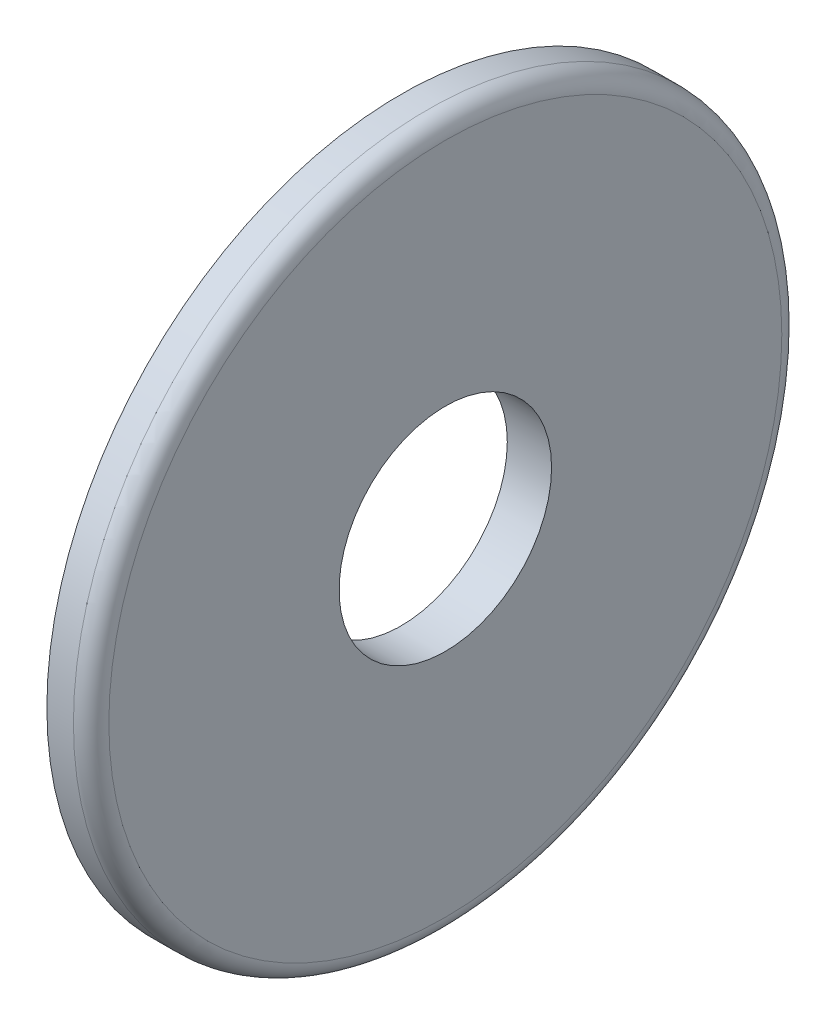
ISO-10303-21;
HEADER;
FILE_DESCRIPTION(('STEP AP214'),'2;1');
FILE_NAME('part.step','',(''),(''),'','','');
FILE_SCHEMA(('AUTOMOTIVE_DESIGN { 1 0 10303 214 1 1 1 1 }'));
ENDSEC;
DATA;
#1=APPLICATION_CONTEXT('core data for automotive mechanical design processes');
#2=APPLICATION_PROTOCOL_DEFINITION('international standard','automotive_design',2000,#1);
#3=PRODUCT_CONTEXT('',#1,'mechanical');
#4=PRODUCT('Part','Part','',(#3));
#5=PRODUCT_RELATED_PRODUCT_CATEGORY('part','',(#4));
#6=PRODUCT_DEFINITION_FORMATION('','',#4);
#7=PRODUCT_DEFINITION_CONTEXT('part definition',#1,'design');
#8=PRODUCT_DEFINITION('design','',#6,#7);
#9=PRODUCT_DEFINITION_SHAPE('','',#8);
#10=(LENGTH_UNIT() NAMED_UNIT(*) SI_UNIT(.MILLI.,.METRE.));
#11=(NAMED_UNIT(*) PLANE_ANGLE_UNIT() SI_UNIT($,.RADIAN.));
#12=(NAMED_UNIT(*) SI_UNIT($,.STERADIAN.) SOLID_ANGLE_UNIT());
#13=UNCERTAINTY_MEASURE_WITH_UNIT(LENGTH_MEASURE(1.E-05),#10,'distance_accuracy_value','');
#14=(GEOMETRIC_REPRESENTATION_CONTEXT(3) GLOBAL_UNCERTAINTY_ASSIGNED_CONTEXT((#13)) GLOBAL_UNIT_ASSIGNED_CONTEXT((#10,
#11,#12)) REPRESENTATION_CONTEXT('',''));
#15=CARTESIAN_POINT('',(0.,0.,0.));
#16=DIRECTION('',(0.,0.,1.));
#17=DIRECTION('',(1.,0.,0.));
#18=AXIS2_PLACEMENT_3D('',#15,#16,#17);
#19=CARTESIAN_POINT('',(1.5875,0.,0.));
#20=DIRECTION('',(1.,0.,0.));
#21=DIRECTION('',(0.,0.,-1.));
#22=AXIS2_PLACEMENT_3D('',#19,#20,#21);
#23=PLANE('',#22);
#24=CARTESIAN_POINT('',(1.5875,0.,0.));
#25=DIRECTION('',(1.,0.,0.));
#26=DIRECTION('',(0.,0.,-1.));
#27=AXIS2_PLACEMENT_3D('',#24,#25,#26);
#28=CIRCLE('',#27,12.065);
#29=CARTESIAN_POINT('',(1.5875,0.,-12.065));
#30=VERTEX_POINT('',#29);
#31=EDGE_CURVE('E45',#30,#30,#28,.T.);
#32=ORIENTED_EDGE('',*,*,#31,.T.);
#33=EDGE_LOOP('',(#32));
#34=FACE_BOUND('',#33,.T.);
#35=CARTESIAN_POINT('',(1.5875,0.,0.));
#36=DIRECTION('',(1.,0.,0.));
#37=DIRECTION('',(0.,0.,-1.));
#38=AXIS2_PLACEMENT_3D('',#35,#36,#37);
#39=CIRCLE('',#38,3.81);
#40=CARTESIAN_POINT('',(1.5875,0.,-3.81));
#41=VERTEX_POINT('',#40);
#42=EDGE_CURVE('E55',#41,#41,#39,.T.);
#43=ORIENTED_EDGE('',*,*,#42,.F.);
#44=EDGE_LOOP('',(#43));
#45=FACE_BOUND('',#44,.T.);
#46=ADVANCED_FACE('F37',(#34,#45),#23,.T.);
#47=CARTESIAN_POINT('',(0.,0.,0.));
#48=DIRECTION('',(1.,0.,0.));
#49=DIRECTION('',(0.,0.,-1.));
#50=AXIS2_PLACEMENT_3D('',#47,#48,#49);
#51=PLANE('',#50);
#52=CARTESIAN_POINT('',(0.,0.,0.));
#53=DIRECTION('',(1.,0.,0.));
#54=DIRECTION('',(0.,0.,-1.));
#55=AXIS2_PLACEMENT_3D('',#52,#53,#54);
#56=CIRCLE('',#55,12.7);
#57=CARTESIAN_POINT('',(0.,0.,-12.7));
#58=VERTEX_POINT('',#57);
#59=EDGE_CURVE('E50',#58,#58,#56,.T.);
#60=ORIENTED_EDGE('',*,*,#59,.F.);
#61=EDGE_LOOP('',(#60));
#62=FACE_BOUND('',#61,.T.);
#63=CARTESIAN_POINT('',(0.,0.,0.));
#64=DIRECTION('',(1.,0.,0.));
#65=DIRECTION('',(0.,0.,-1.));
#66=AXIS2_PLACEMENT_3D('',#63,#64,#65);
#67=CIRCLE('',#66,3.81);
#68=CARTESIAN_POINT('',(0.,0.,-3.81));
#69=VERTEX_POINT('',#68);
#70=EDGE_CURVE('E58',#69,#69,#67,.T.);
#71=ORIENTED_EDGE('',*,*,#70,.T.);
#72=EDGE_LOOP('',(#71));
#73=FACE_BOUND('',#72,.T.);
#74=ADVANCED_FACE('F70',(#62,#73),#51,.F.);
#75=CARTESIAN_POINT('',(1.5875,0.,0.));
#76=DIRECTION('',(-1.,0.,0.));
#77=DIRECTION('',(0.,0.,1.));
#78=AXIS2_PLACEMENT_3D('',#75,#76,#77);
#79=CYLINDRICAL_SURFACE('',#78,12.7);
#80=CARTESIAN_POINT('',(0.9525,0.,0.));
#81=DIRECTION('',(1.,0.,0.));
#82=DIRECTION('',(0.,0.,-1.));
#83=AXIS2_PLACEMENT_3D('',#80,#81,#82);
#84=CIRCLE('',#83,12.7);
#85=CARTESIAN_POINT('',(0.9525,0.,-12.7));
#86=VERTEX_POINT('',#85);
#87=EDGE_CURVE('E10',#86,#86,#84,.F.);
#88=ORIENTED_EDGE('',*,*,#87,.T.);
#89=EDGE_LOOP('',(#88));
#90=FACE_BOUND('',#89,.T.);
#91=ORIENTED_EDGE('',*,*,#59,.T.);
#92=EDGE_LOOP('',(#91));
#93=FACE_BOUND('',#92,.T.);
#94=ADVANCED_FACE('F75',(#90,#93),#79,.T.);
#95=CARTESIAN_POINT('',(1.5875,0.,0.));
#96=DIRECTION('',(-1.,0.,0.));
#97=DIRECTION('',(0.,0.,1.));
#98=AXIS2_PLACEMENT_3D('',#95,#96,#97);
#99=CYLINDRICAL_SURFACE('',#98,3.81);
#100=ORIENTED_EDGE('',*,*,#42,.T.);
#101=EDGE_LOOP('',(#100));
#102=FACE_BOUND('',#101,.T.);
#103=ORIENTED_EDGE('',*,*,#70,.F.);
#104=EDGE_LOOP('',(#103));
#105=FACE_BOUND('',#104,.T.);
#106=ADVANCED_FACE('F66',(#102,#105),#99,.F.);
#107=CARTESIAN_POINT('',(0.9525,0.,0.));
#108=DIRECTION('',(1.,0.,0.));
#109=DIRECTION('',(0.,0.,-1.));
#110=AXIS2_PLACEMENT_3D('',#107,#108,#109);
#111=TOROIDAL_SURFACE('',#110,12.065,0.635);
#112=ORIENTED_EDGE('',*,*,#87,.F.);
#113=EDGE_LOOP('',(#112));
#114=FACE_BOUND('',#113,.T.);
#115=ORIENTED_EDGE('',*,*,#31,.F.);
#116=EDGE_LOOP('',(#115));
#117=FACE_BOUND('',#116,.T.);
#118=ADVANCED_FACE('F39',(#114,#117),#111,.T.);
#119=CLOSED_SHELL('',(#46,#74,#94,#106,#118));
#120=MANIFOLD_SOLID_BREP('B2',#119);
#121=ADVANCED_BREP_SHAPE_REPRESENTATION('',(#18,#120),#14);
#122=SHAPE_DEFINITION_REPRESENTATION(#9,#121);
ENDSEC;
END-ISO-10303-21;
